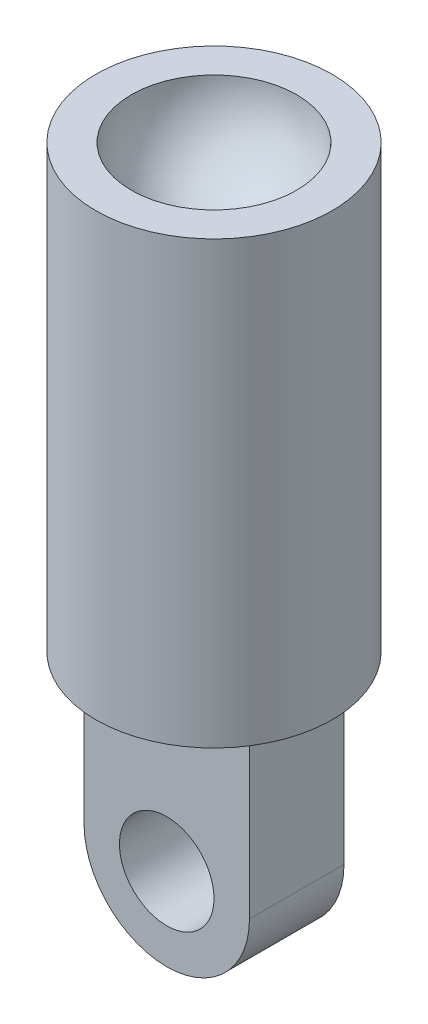
ISO-10303-21;
HEADER;
FILE_DESCRIPTION(('STEP AP214'),'2;1');
FILE_NAME('part.step','',(''),(''),'','','');
FILE_SCHEMA(('AUTOMOTIVE_DESIGN { 1 0 10303 214 1 1 1 1 }'));
ENDSEC;
DATA;
#1=APPLICATION_CONTEXT('core data for automotive mechanical design processes');
#2=APPLICATION_PROTOCOL_DEFINITION('international standard','automotive_design',2000,#1);
#3=PRODUCT_CONTEXT('',#1,'mechanical');
#4=PRODUCT('Part','Part','',(#3));
#5=PRODUCT_RELATED_PRODUCT_CATEGORY('part','',(#4));
#6=PRODUCT_DEFINITION_FORMATION('','',#4);
#7=PRODUCT_DEFINITION_CONTEXT('part definition',#1,'design');
#8=PRODUCT_DEFINITION('design','',#6,#7);
#9=PRODUCT_DEFINITION_SHAPE('','',#8);
#10=(LENGTH_UNIT() NAMED_UNIT(*) SI_UNIT(.MILLI.,.METRE.));
#11=(NAMED_UNIT(*) PLANE_ANGLE_UNIT() SI_UNIT($,.RADIAN.));
#12=(NAMED_UNIT(*) SI_UNIT($,.STERADIAN.) SOLID_ANGLE_UNIT());
#13=UNCERTAINTY_MEASURE_WITH_UNIT(LENGTH_MEASURE(1.E-05),#10,'distance_accuracy_value','');
#14=(GEOMETRIC_REPRESENTATION_CONTEXT(3) GLOBAL_UNCERTAINTY_ASSIGNED_CONTEXT((#13)) GLOBAL_UNIT_ASSIGNED_CONTEXT((#10,
#11,#12)) REPRESENTATION_CONTEXT('',''));
#15=CARTESIAN_POINT('',(0.,0.,0.));
#16=DIRECTION('',(0.,0.,1.));
#17=DIRECTION('',(1.,0.,0.));
#18=AXIS2_PLACEMENT_3D('',#15,#16,#17);
#19=CARTESIAN_POINT('',(0.,-37.3039158271795,0.));
#20=DIRECTION('',(0.,-1.,0.));
#21=DIRECTION('',(0.,0.,-1.));
#22=AXIS2_PLACEMENT_3D('',#19,#20,#21);
#23=PLANE('',#22);
#24=DIRECTION('',(0.,0.,-1.));
#25=VECTOR('',#24,1.);
#26=CARTESIAN_POINT('',(8.,-37.3039158271795,0.));
#27=LINE('',#26,#25);
#28=CARTESIAN_POINT('',(8.,-37.3039158271795,5.));
#29=VERTEX_POINT('',#28);
#30=CARTESIAN_POINT('',(8.,-37.3039158271795,-5.));
#31=VERTEX_POINT('',#30);
#32=EDGE_CURVE('E141',#29,#31,#27,.T.);
#33=ORIENTED_EDGE('',*,*,#32,.T.);
#34=DIRECTION('',(-1.,0.,0.));
#35=VECTOR('',#34,1.);
#36=CARTESIAN_POINT('',(0.,-37.3039158271795,-5.));
#37=LINE('',#36,#35);
#38=CARTESIAN_POINT('',(-8.,-37.3039158271795,-5.));
#39=VERTEX_POINT('',#38);
#40=EDGE_CURVE('E144',#31,#39,#37,.T.);
#41=ORIENTED_EDGE('',*,*,#40,.T.);
#42=DIRECTION('',(0.,0.,-1.));
#43=VECTOR('',#42,1.);
#44=CARTESIAN_POINT('',(-8.,-37.3039158271795,0.));
#45=LINE('',#44,#43);
#46=CARTESIAN_POINT('',(-8.,-37.3039158271795,5.));
#47=VERTEX_POINT('',#46);
#48=EDGE_CURVE('E135',#39,#47,#45,.F.);
#49=ORIENTED_EDGE('',*,*,#48,.T.);
#50=DIRECTION('',(-1.,0.,0.));
#51=VECTOR('',#50,1.);
#52=CARTESIAN_POINT('',(7.,-37.3039158271795,5.));
#53=LINE('',#52,#51);
#54=EDGE_CURVE('E138',#47,#29,#53,.F.);
#55=ORIENTED_EDGE('',*,*,#54,.T.);
#56=EDGE_LOOP('',(#33,#41,#49,#55));
#57=FACE_BOUND('',#56,.T.);
#58=CARTESIAN_POINT('',(0.,-37.3039158271795,0.));
#59=DIRECTION('',(0.,1.,0.));
#60=DIRECTION('',(0.,0.,1.));
#61=AXIS2_PLACEMENT_3D('',#58,#59,#60);
#62=CIRCLE('',#61,9.99999999999999);
#63=CARTESIAN_POINT('',(0.,-37.3039158271795,9.99999999999999));
#64=VERTEX_POINT('',#63);
#65=EDGE_CURVE('E117',#64,#64,#62,.T.);
#66=ORIENTED_EDGE('',*,*,#65,.F.);
#67=EDGE_LOOP('',(#66));
#68=FACE_BOUND('',#67,.T.);
#69=ADVANCED_FACE('F41',(#57,#68),#23,.T.);
#70=CARTESIAN_POINT('',(0.,0.,0.));
#71=DIRECTION('',(0.,1.,0.));
#72=DIRECTION('',(-1.,0.,0.));
#73=AXIS2_PLACEMENT_3D('',#70,#71,#72);
#74=SPHERICAL_SURFACE('',#73,7.);
#75=CARTESIAN_POINT('',(0.,0.,0.));
#76=DIRECTION('',(0.,1.,0.));
#77=DIRECTION('',(0.,0.,1.));
#78=AXIS2_PLACEMENT_3D('',#75,#76,#77);
#79=CIRCLE('',#78,7.);
#80=CARTESIAN_POINT('',(0.,0.,7.));
#81=VERTEX_POINT('',#80);
#82=EDGE_CURVE('E131',#81,#81,#79,.T.);
#83=ORIENTED_EDGE('',*,*,#82,.T.);
#84=EDGE_LOOP('',(#83));
#85=FACE_BOUND('',#84,.T.);
#86=ADVANCED_FACE('F216',(#85),#74,.F.);
#87=CARTESIAN_POINT('',(0.,0.,0.));
#88=DIRECTION('',(0.,1.,0.));
#89=DIRECTION('',(0.,0.,1.));
#90=AXIS2_PLACEMENT_3D('',#87,#88,#89);
#91=PLANE('',#90);
#92=CARTESIAN_POINT('',(0.,0.,0.));
#93=DIRECTION('',(0.,1.,0.));
#94=DIRECTION('',(0.,0.,1.));
#95=AXIS2_PLACEMENT_3D('',#92,#93,#94);
#96=CIRCLE('',#95,10.);
#97=CARTESIAN_POINT('',(0.,0.,10.));
#98=VERTEX_POINT('',#97);
#99=EDGE_CURVE('E123',#98,#98,#96,.T.);
#100=ORIENTED_EDGE('',*,*,#99,.T.);
#101=EDGE_LOOP('',(#100));
#102=FACE_BOUND('',#101,.T.);
#103=ORIENTED_EDGE('',*,*,#82,.F.);
#104=EDGE_LOOP('',(#103));
#105=FACE_BOUND('',#104,.T.);
#106=ADVANCED_FACE('F221',(#102,#105),#91,.T.);
#107=CARTESIAN_POINT('',(0.,4.02466562422416,0.));
#108=DIRECTION('',(0.,1.,0.));
#109=DIRECTION('',(0.,0.,1.));
#110=AXIS2_PLACEMENT_3D('',#107,#108,#109);
#111=CYLINDRICAL_SURFACE('',#110,10.);
#112=ORIENTED_EDGE('',*,*,#65,.T.);
#113=EDGE_LOOP('',(#112));
#114=FACE_BOUND('',#113,.T.);
#115=ORIENTED_EDGE('',*,*,#99,.F.);
#116=EDGE_LOOP('',(#115));
#117=FACE_BOUND('',#116,.T.);
#118=ADVANCED_FACE('F227',(#114,#117),#111,.T.);
#119=CARTESIAN_POINT('',(0.,-51.4,4.));
#120=DIRECTION('',(0.,0.,1.));
#121=DIRECTION('',(1.,0.,0.));
#122=AXIS2_PLACEMENT_3D('',#119,#120,#121);
#123=PLANE('',#122);
#124=DIRECTION('',(0.,1.,0.));
#125=VECTOR('',#124,1.);
#126=CARTESIAN_POINT('',(7.,-51.4,4.));
#127=LINE('',#126,#125);
#128=CARTESIAN_POINT('',(7.,-51.4,4.));
#129=VERTEX_POINT('',#128);
#130=CARTESIAN_POINT('',(7.,-38.3039158271795,4.));
#131=VERTEX_POINT('',#130);
#132=EDGE_CURVE('E94',#129,#131,#127,.T.);
#133=ORIENTED_EDGE('',*,*,#132,.T.);
#134=DIRECTION('',(-1.,0.,0.));
#135=VECTOR('',#134,1.);
#136=CARTESIAN_POINT('',(-7.,-38.3039158271795,4.));
#137=LINE('',#136,#135);
#138=CARTESIAN_POINT('',(-7.,-38.3039158271795,4.));
#139=VERTEX_POINT('',#138);
#140=EDGE_CURVE('E51',#131,#139,#137,.T.);
#141=ORIENTED_EDGE('',*,*,#140,.T.);
#142=DIRECTION('',(0.,-1.,0.));
#143=VECTOR('',#142,1.);
#144=CARTESIAN_POINT('',(-7.,-51.4,4.));
#145=LINE('',#144,#143);
#146=CARTESIAN_POINT('',(-7.,-51.4,4.));
#147=VERTEX_POINT('',#146);
#148=EDGE_CURVE('E101',#139,#147,#145,.T.);
#149=ORIENTED_EDGE('',*,*,#148,.T.);
#150=CARTESIAN_POINT('',(0.,-51.4,4.));
#151=DIRECTION('',(0.,0.,1.));
#152=DIRECTION('',(1.,0.,0.));
#153=AXIS2_PLACEMENT_3D('',#150,#151,#152);
#154=CIRCLE('',#153,7.);
#155=EDGE_CURVE('E102',#147,#129,#154,.T.);
#156=ORIENTED_EDGE('',*,*,#155,.T.);
#157=EDGE_LOOP('',(#133,#141,#149,#156));
#158=FACE_BOUND('',#157,.T.);
#159=CARTESIAN_POINT('',(0.,-51.4,4.));
#160=DIRECTION('',(0.,0.,1.));
#161=DIRECTION('',(1.,0.,0.));
#162=AXIS2_PLACEMENT_3D('',#159,#160,#161);
#163=CIRCLE('',#162,4.);
#164=CARTESIAN_POINT('',(4.,-51.4,4.));
#165=VERTEX_POINT('',#164);
#166=EDGE_CURVE('E176',#165,#165,#163,.T.);
#167=ORIENTED_EDGE('',*,*,#166,.F.);
#168=EDGE_LOOP('',(#167));
#169=FACE_BOUND('',#168,.T.);
#170=ADVANCED_FACE('F105',(#158,#169),#123,.T.);
#171=CARTESIAN_POINT('',(0.,-51.4,-4.));
#172=DIRECTION('',(0.,0.,1.));
#173=DIRECTION('',(1.,0.,0.));
#174=AXIS2_PLACEMENT_3D('',#171,#172,#173);
#175=PLANE('',#174);
#176=DIRECTION('',(0.,-1.,0.));
#177=VECTOR('',#176,1.);
#178=CARTESIAN_POINT('',(-7.,-51.4,-4.));
#179=LINE('',#178,#177);
#180=CARTESIAN_POINT('',(-7.,-38.3039158271795,-4.));
#181=VERTEX_POINT('',#180);
#182=CARTESIAN_POINT('',(-7.,-51.4,-4.));
#183=VERTEX_POINT('',#182);
#184=EDGE_CURVE('E111',#181,#183,#179,.T.);
#185=ORIENTED_EDGE('',*,*,#184,.F.);
#186=DIRECTION('',(-1.,0.,0.));
#187=VECTOR('',#186,1.);
#188=CARTESIAN_POINT('',(0.,-38.3039158271795,-4.));
#189=LINE('',#188,#187);
#190=CARTESIAN_POINT('',(7.,-38.3039158271795,-4.));
#191=VERTEX_POINT('',#190);
#192=EDGE_CURVE('E148',#181,#191,#189,.F.);
#193=ORIENTED_EDGE('',*,*,#192,.T.);
#194=DIRECTION('',(0.,1.,0.));
#195=VECTOR('',#194,1.);
#196=CARTESIAN_POINT('',(7.,-51.4,-4.));
#197=LINE('',#196,#195);
#198=CARTESIAN_POINT('',(7.,-51.4,-4.));
#199=VERTEX_POINT('',#198);
#200=EDGE_CURVE('E188',#199,#191,#197,.T.);
#201=ORIENTED_EDGE('',*,*,#200,.F.);
#202=CARTESIAN_POINT('',(0.,-51.4,-4.));
#203=DIRECTION('',(0.,0.,1.));
#204=DIRECTION('',(1.,0.,0.));
#205=AXIS2_PLACEMENT_3D('',#202,#203,#204);
#206=CIRCLE('',#205,7.);
#207=EDGE_CURVE('E115',#183,#199,#206,.T.);
#208=ORIENTED_EDGE('',*,*,#207,.F.);
#209=EDGE_LOOP('',(#185,#193,#201,#208));
#210=FACE_BOUND('',#209,.T.);
#211=CARTESIAN_POINT('',(0.,-51.4,-4.));
#212=DIRECTION('',(0.,0.,1.));
#213=DIRECTION('',(1.,0.,0.));
#214=AXIS2_PLACEMENT_3D('',#211,#212,#213);
#215=CIRCLE('',#214,4.);
#216=CARTESIAN_POINT('',(4.,-51.4,-4.));
#217=VERTEX_POINT('',#216);
#218=EDGE_CURVE('E170',#217,#217,#215,.T.);
#219=ORIENTED_EDGE('',*,*,#218,.T.);
#220=EDGE_LOOP('',(#219));
#221=FACE_BOUND('',#220,.T.);
#222=ADVANCED_FACE('F196',(#210,#221),#175,.F.);
#223=CARTESIAN_POINT('',(0.,-51.4,4.));
#224=DIRECTION('',(0.,0.,-1.));
#225=DIRECTION('',(-1.,0.,0.));
#226=AXIS2_PLACEMENT_3D('',#223,#224,#225);
#227=CYLINDRICAL_SURFACE('',#226,7.);
#228=ORIENTED_EDGE('',*,*,#207,.T.);
#229=DIRECTION('',(0.,0.,-1.));
#230=VECTOR('',#229,1.);
#231=CARTESIAN_POINT('',(7.,-51.4,4.));
#232=LINE('',#231,#230);
#233=EDGE_CURVE('E98',#129,#199,#232,.T.);
#234=ORIENTED_EDGE('',*,*,#233,.F.);
#235=ORIENTED_EDGE('',*,*,#155,.F.);
#236=DIRECTION('',(0.,0.,-1.));
#237=VECTOR('',#236,1.);
#238=CARTESIAN_POINT('',(-7.,-51.4,4.));
#239=LINE('',#238,#237);
#240=EDGE_CURVE('E118',#147,#183,#239,.T.);
#241=ORIENTED_EDGE('',*,*,#240,.T.);
#242=EDGE_LOOP('',(#228,#234,#235,#241));
#243=FACE_BOUND('',#242,.T.);
#244=ADVANCED_FACE('F113',(#243),#227,.T.);
#245=CARTESIAN_POINT('',(7.,-51.4,4.));
#246=DIRECTION('',(-1.,0.,0.));
#247=DIRECTION('',(0.,-1.,0.));
#248=AXIS2_PLACEMENT_3D('',#245,#246,#247);
#249=PLANE('',#248);
#250=ORIENTED_EDGE('',*,*,#200,.T.);
#251=DIRECTION('',(0.,0.,-1.));
#252=VECTOR('',#251,1.);
#253=CARTESIAN_POINT('',(7.,-38.3039158271795,4.));
#254=LINE('',#253,#252);
#255=EDGE_CURVE('E66',#191,#131,#254,.F.);
#256=ORIENTED_EDGE('',*,*,#255,.T.);
#257=ORIENTED_EDGE('',*,*,#132,.F.);
#258=ORIENTED_EDGE('',*,*,#233,.T.);
#259=EDGE_LOOP('',(#250,#256,#257,#258));
#260=FACE_BOUND('',#259,.T.);
#261=ADVANCED_FACE('F96',(#260),#249,.F.);
#262=CARTESIAN_POINT('',(-7.,-51.4,4.));
#263=DIRECTION('',(1.,0.,0.));
#264=DIRECTION('',(0.,1.,0.));
#265=AXIS2_PLACEMENT_3D('',#262,#263,#264);
#266=PLANE('',#265);
#267=ORIENTED_EDGE('',*,*,#148,.F.);
#268=DIRECTION('',(0.,0.,-1.));
#269=VECTOR('',#268,1.);
#270=CARTESIAN_POINT('',(-7.,-38.3039158271795,4.));
#271=LINE('',#270,#269);
#272=EDGE_CURVE('E11',#139,#181,#271,.T.);
#273=ORIENTED_EDGE('',*,*,#272,.T.);
#274=ORIENTED_EDGE('',*,*,#184,.T.);
#275=ORIENTED_EDGE('',*,*,#240,.F.);
#276=EDGE_LOOP('',(#267,#273,#274,#275));
#277=FACE_BOUND('',#276,.T.);
#278=ADVANCED_FACE('F193',(#277),#266,.F.);
#279=CARTESIAN_POINT('',(0.,-51.4,4.));
#280=DIRECTION('',(0.,0.,-1.));
#281=DIRECTION('',(-1.,0.,0.));
#282=AXIS2_PLACEMENT_3D('',#279,#280,#281);
#283=CYLINDRICAL_SURFACE('',#282,4.);
#284=ORIENTED_EDGE('',*,*,#166,.T.);
#285=EDGE_LOOP('',(#284));
#286=FACE_BOUND('',#285,.T.);
#287=ORIENTED_EDGE('',*,*,#218,.F.);
#288=EDGE_LOOP('',(#287));
#289=FACE_BOUND('',#288,.T.);
#290=ADVANCED_FACE('F213',(#286,#289),#283,.F.);
#291=CARTESIAN_POINT('',(0.,-38.3039158271795,5.));
#292=DIRECTION('',(1.,0.,0.));
#293=DIRECTION('',(0.,0.,-1.));
#294=AXIS2_PLACEMENT_3D('',#291,#292,#293);
#295=CYLINDRICAL_SURFACE('',#294,1.);
#296=CARTESIAN_POINT('',(-8.,-38.3039158271795,5.));
#297=DIRECTION('',(-0.707106781186547,0.,-0.707106781186547));
#298=DIRECTION('',(0.707106781186547,0.,-0.707106781186547));
#299=AXIS2_PLACEMENT_3D('',#296,#297,#298);
#300=ELLIPSE('',#299,1.41421356237309,1.);
#301=EDGE_CURVE('E161',#139,#47,#300,.F.);
#302=ORIENTED_EDGE('',*,*,#301,.F.);
#303=ORIENTED_EDGE('',*,*,#140,.F.);
#304=CARTESIAN_POINT('',(8.,-38.3039158271795,5.));
#305=DIRECTION('',(0.707106781186547,0.,-0.707106781186547));
#306=DIRECTION('',(0.707106781186547,0.,0.707106781186547));
#307=AXIS2_PLACEMENT_3D('',#304,#305,#306);
#308=ELLIPSE('',#307,1.41421356237309,1.);
#309=EDGE_CURVE('E45',#29,#131,#308,.F.);
#310=ORIENTED_EDGE('',*,*,#309,.F.);
#311=ORIENTED_EDGE('',*,*,#54,.F.);
#312=EDGE_LOOP('',(#302,#303,#310,#311));
#313=FACE_BOUND('',#312,.T.);
#314=ADVANCED_FACE('F43',(#313),#295,.F.);
#315=CARTESIAN_POINT('',(8.,-38.3039158271795,0.));
#316=DIRECTION('',(0.,0.,-1.));
#317=DIRECTION('',(-1.,0.,0.));
#318=AXIS2_PLACEMENT_3D('',#315,#316,#317);
#319=CYLINDRICAL_SURFACE('',#318,1.);
#320=ORIENTED_EDGE('',*,*,#309,.T.);
#321=ORIENTED_EDGE('',*,*,#255,.F.);
#322=CARTESIAN_POINT('',(8.,-38.3039158271795,-5.));
#323=DIRECTION('',(-0.707106781186547,0.,-0.707106781186547));
#324=DIRECTION('',(0.707106781186547,0.,-0.707106781186547));
#325=AXIS2_PLACEMENT_3D('',#322,#323,#324);
#326=ELLIPSE('',#325,1.41421356237309,1.);
#327=EDGE_CURVE('E159',#31,#191,#326,.F.);
#328=ORIENTED_EDGE('',*,*,#327,.F.);
#329=ORIENTED_EDGE('',*,*,#32,.F.);
#330=EDGE_LOOP('',(#320,#321,#328,#329));
#331=FACE_BOUND('',#330,.T.);
#332=ADVANCED_FACE('F206',(#331),#319,.F.);
#333=CARTESIAN_POINT('',(-8.,-38.3039158271795,4.));
#334=DIRECTION('',(0.,0.,-1.));
#335=DIRECTION('',(-1.,0.,0.));
#336=AXIS2_PLACEMENT_3D('',#333,#334,#335);
#337=CYLINDRICAL_SURFACE('',#336,1.);
#338=ORIENTED_EDGE('',*,*,#301,.T.);
#339=ORIENTED_EDGE('',*,*,#48,.F.);
#340=CARTESIAN_POINT('',(-8.,-38.3039158271795,-5.));
#341=DIRECTION('',(0.707106781186547,0.,-0.707106781186547));
#342=DIRECTION('',(-0.707106781186547,0.,-0.707106781186547));
#343=AXIS2_PLACEMENT_3D('',#340,#341,#342);
#344=ELLIPSE('',#343,1.41421356237309,1.);
#345=EDGE_CURVE('E156',#181,#39,#344,.F.);
#346=ORIENTED_EDGE('',*,*,#345,.F.);
#347=ORIENTED_EDGE('',*,*,#272,.F.);
#348=EDGE_LOOP('',(#338,#339,#346,#347));
#349=FACE_BOUND('',#348,.T.);
#350=ADVANCED_FACE('F202',(#349),#337,.F.);
#351=CARTESIAN_POINT('',(0.,-38.3039158271795,-5.));
#352=DIRECTION('',(-1.,0.,0.));
#353=DIRECTION('',(0.,0.,1.));
#354=AXIS2_PLACEMENT_3D('',#351,#352,#353);
#355=CYLINDRICAL_SURFACE('',#354,1.);
#356=ORIENTED_EDGE('',*,*,#327,.T.);
#357=ORIENTED_EDGE('',*,*,#192,.F.);
#358=ORIENTED_EDGE('',*,*,#345,.T.);
#359=ORIENTED_EDGE('',*,*,#40,.F.);
#360=EDGE_LOOP('',(#356,#357,#358,#359));
#361=FACE_BOUND('',#360,.T.);
#362=ADVANCED_FACE('F199',(#361),#355,.F.);
#363=CLOSED_SHELL('',(#69,#86,#106,#118,#170,#222,#244,#261,#278,#290,#314,#332,#350,#362));
#364=MANIFOLD_SOLID_BREP('B2',#363);
#365=ADVANCED_BREP_SHAPE_REPRESENTATION('',(#18,#364),#14);
#366=SHAPE_DEFINITION_REPRESENTATION(#9,#365);
ENDSEC;
END-ISO-10303-21;
